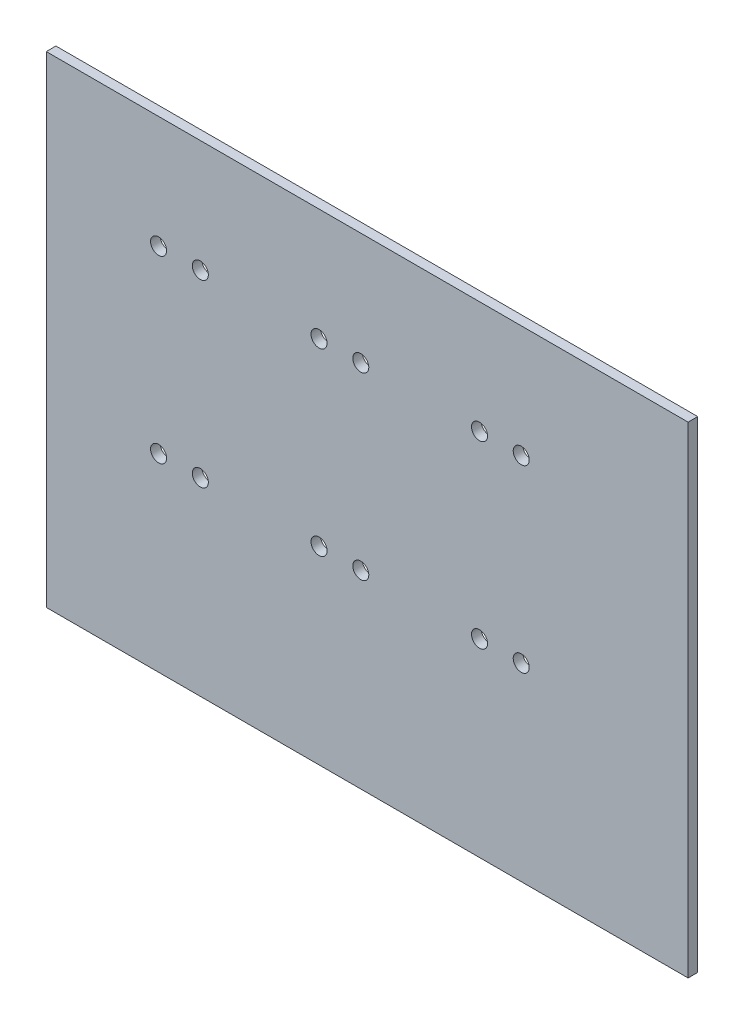
ISO-10303-21;
HEADER;
FILE_DESCRIPTION(('STEP AP214'),'2;1');
FILE_NAME('part.step','',(''),(''),'','','');
FILE_SCHEMA(('AUTOMOTIVE_DESIGN { 1 0 10303 214 1 1 1 1 }'));
ENDSEC;
DATA;
#1=APPLICATION_CONTEXT('core data for automotive mechanical design processes');
#2=APPLICATION_PROTOCOL_DEFINITION('international standard','automotive_design',2000,#1);
#3=PRODUCT_CONTEXT('',#1,'mechanical');
#4=PRODUCT('Part','Part','',(#3));
#5=PRODUCT_RELATED_PRODUCT_CATEGORY('part','',(#4));
#6=PRODUCT_DEFINITION_FORMATION('','',#4);
#7=PRODUCT_DEFINITION_CONTEXT('part definition',#1,'design');
#8=PRODUCT_DEFINITION('design','',#6,#7);
#9=PRODUCT_DEFINITION_SHAPE('','',#8);
#10=(LENGTH_UNIT() NAMED_UNIT(*) SI_UNIT(.MILLI.,.METRE.));
#11=(NAMED_UNIT(*) PLANE_ANGLE_UNIT() SI_UNIT($,.RADIAN.));
#12=(NAMED_UNIT(*) SI_UNIT($,.STERADIAN.) SOLID_ANGLE_UNIT());
#13=UNCERTAINTY_MEASURE_WITH_UNIT(LENGTH_MEASURE(1.E-05),#10,'distance_accuracy_value','');
#14=(GEOMETRIC_REPRESENTATION_CONTEXT(3) GLOBAL_UNCERTAINTY_ASSIGNED_CONTEXT((#13)) GLOBAL_UNIT_ASSIGNED_CONTEXT((#10,
#11,#12)) REPRESENTATION_CONTEXT('',''));
#15=CARTESIAN_POINT('',(0.,0.,0.));
#16=DIRECTION('',(0.,0.,1.));
#17=DIRECTION('',(1.,0.,0.));
#18=AXIS2_PLACEMENT_3D('',#15,#16,#17);
#19=CARTESIAN_POINT('',(100.,75.,3.));
#20=DIRECTION('',(-1.,0.,0.));
#21=DIRECTION('',(0.,-1.,0.));
#22=AXIS2_PLACEMENT_3D('',#19,#20,#21);
#23=PLANE('',#22);
#24=DIRECTION('',(0.,1.,0.));
#25=VECTOR('',#24,1.);
#26=CARTESIAN_POINT('',(100.,75.,0.));
#27=LINE('',#26,#25);
#28=CARTESIAN_POINT('',(100.,-75.,0.));
#29=VERTEX_POINT('',#28);
#30=CARTESIAN_POINT('',(100.,75.,0.));
#31=VERTEX_POINT('',#30);
#32=EDGE_CURVE('E111',#29,#31,#27,.T.);
#33=ORIENTED_EDGE('',*,*,#32,.T.);
#34=DIRECTION('',(0.,0.,-1.));
#35=VECTOR('',#34,1.);
#36=CARTESIAN_POINT('',(100.,75.,3.));
#37=LINE('',#36,#35);
#38=CARTESIAN_POINT('',(100.,75.,3.));
#39=VERTEX_POINT('',#38);
#40=EDGE_CURVE('E11',#39,#31,#37,.T.);
#41=ORIENTED_EDGE('',*,*,#40,.F.);
#42=DIRECTION('',(0.,1.,0.));
#43=VECTOR('',#42,1.);
#44=CARTESIAN_POINT('',(100.,75.,3.));
#45=LINE('',#44,#43);
#46=CARTESIAN_POINT('',(100.,-75.,3.));
#47=VERTEX_POINT('',#46);
#48=EDGE_CURVE('E100',#47,#39,#45,.T.);
#49=ORIENTED_EDGE('',*,*,#48,.F.);
#50=DIRECTION('',(0.,0.,-1.));
#51=VECTOR('',#50,1.);
#52=CARTESIAN_POINT('',(100.,-75.,3.));
#53=LINE('',#52,#51);
#54=EDGE_CURVE('E109',#47,#29,#53,.T.);
#55=ORIENTED_EDGE('',*,*,#54,.T.);
#56=EDGE_LOOP('',(#33,#41,#49,#55));
#57=FACE_BOUND('',#56,.T.);
#58=ADVANCED_FACE('F44',(#57),#23,.F.);
#59=CARTESIAN_POINT('',(-100.,75.,3.));
#60=DIRECTION('',(0.,-1.,0.));
#61=DIRECTION('',(0.,0.,-1.));
#62=AXIS2_PLACEMENT_3D('',#59,#60,#61);
#63=PLANE('',#62);
#64=DIRECTION('',(-1.,0.,0.));
#65=VECTOR('',#64,1.);
#66=CARTESIAN_POINT('',(-100.,75.,0.));
#67=LINE('',#66,#65);
#68=CARTESIAN_POINT('',(-100.,75.,0.));
#69=VERTEX_POINT('',#68);
#70=EDGE_CURVE('E105',#31,#69,#67,.T.);
#71=ORIENTED_EDGE('',*,*,#70,.T.);
#72=DIRECTION('',(0.,0.,-1.));
#73=VECTOR('',#72,1.);
#74=CARTESIAN_POINT('',(-100.,75.,3.));
#75=LINE('',#74,#73);
#76=CARTESIAN_POINT('',(-100.,75.,3.));
#77=VERTEX_POINT('',#76);
#78=EDGE_CURVE('E53',#77,#69,#75,.T.);
#79=ORIENTED_EDGE('',*,*,#78,.F.);
#80=DIRECTION('',(-1.,0.,0.));
#81=VECTOR('',#80,1.);
#82=CARTESIAN_POINT('',(-100.,75.,3.));
#83=LINE('',#82,#81);
#84=EDGE_CURVE('E95',#39,#77,#83,.T.);
#85=ORIENTED_EDGE('',*,*,#84,.F.);
#86=ORIENTED_EDGE('',*,*,#40,.T.);
#87=EDGE_LOOP('',(#71,#79,#85,#86));
#88=FACE_BOUND('',#87,.T.);
#89=ADVANCED_FACE('F102',(#88),#63,.F.);
#90=CARTESIAN_POINT('',(-100.,75.,3.));
#91=DIRECTION('',(1.,0.,0.));
#92=DIRECTION('',(0.,1.,0.));
#93=AXIS2_PLACEMENT_3D('',#90,#91,#92);
#94=PLANE('',#93);
#95=DIRECTION('',(0.,-1.,0.));
#96=VECTOR('',#95,1.);
#97=CARTESIAN_POINT('',(-100.,75.,0.));
#98=LINE('',#97,#96);
#99=CARTESIAN_POINT('',(-100.,-75.,0.));
#100=VERTEX_POINT('',#99);
#101=EDGE_CURVE('E80',#69,#100,#98,.T.);
#102=ORIENTED_EDGE('',*,*,#101,.T.);
#103=DIRECTION('',(0.,0.,-1.));
#104=VECTOR('',#103,1.);
#105=CARTESIAN_POINT('',(-100.,-75.,3.));
#106=LINE('',#105,#104);
#107=CARTESIAN_POINT('',(-100.,-75.,3.));
#108=VERTEX_POINT('',#107);
#109=EDGE_CURVE('E101',#108,#100,#106,.T.);
#110=ORIENTED_EDGE('',*,*,#109,.F.);
#111=DIRECTION('',(0.,-1.,0.));
#112=VECTOR('',#111,1.);
#113=CARTESIAN_POINT('',(-100.,75.,3.));
#114=LINE('',#113,#112);
#115=EDGE_CURVE('E94',#77,#108,#114,.T.);
#116=ORIENTED_EDGE('',*,*,#115,.F.);
#117=ORIENTED_EDGE('',*,*,#78,.T.);
#118=EDGE_LOOP('',(#102,#110,#116,#117));
#119=FACE_BOUND('',#118,.T.);
#120=ADVANCED_FACE('F103',(#119),#94,.F.);
#121=CARTESIAN_POINT('',(-100.,-75.,3.));
#122=DIRECTION('',(0.,1.,0.));
#123=DIRECTION('',(0.,0.,1.));
#124=AXIS2_PLACEMENT_3D('',#121,#122,#123);
#125=PLANE('',#124);
#126=DIRECTION('',(1.,0.,0.));
#127=VECTOR('',#126,1.);
#128=CARTESIAN_POINT('',(-100.,-75.,0.));
#129=LINE('',#128,#127);
#130=EDGE_CURVE('E82',#100,#29,#129,.T.);
#131=ORIENTED_EDGE('',*,*,#130,.T.);
#132=ORIENTED_EDGE('',*,*,#54,.F.);
#133=DIRECTION('',(1.,0.,0.));
#134=VECTOR('',#133,1.);
#135=CARTESIAN_POINT('',(-100.,-75.,3.));
#136=LINE('',#135,#134);
#137=EDGE_CURVE('E65',#108,#47,#136,.T.);
#138=ORIENTED_EDGE('',*,*,#137,.F.);
#139=ORIENTED_EDGE('',*,*,#109,.T.);
#140=EDGE_LOOP('',(#131,#132,#138,#139));
#141=FACE_BOUND('',#140,.T.);
#142=ADVANCED_FACE('F130',(#141),#125,.F.);
#143=CARTESIAN_POINT('',(0.,0.,3.));
#144=DIRECTION('',(0.,0.,1.));
#145=DIRECTION('',(1.,0.,0.));
#146=AXIS2_PLACEMENT_3D('',#143,#144,#145);
#147=PLANE('',#146);
#148=CARTESIAN_POINT('',(-1.99999999999999,-16.,3.));
#149=DIRECTION('',(0.,0.,1.));
#150=DIRECTION('',(1.,0.,0.));
#151=AXIS2_PLACEMENT_3D('',#148,#149,#150);
#152=CIRCLE('',#151,2.5);
#153=CARTESIAN_POINT('',(0.500000000000007,-16.,3.));
#154=VERTEX_POINT('',#153);
#155=EDGE_CURVE('E163',#154,#154,#152,.T.);
#156=ORIENTED_EDGE('',*,*,#155,.F.);
#157=EDGE_LOOP('',(#156));
#158=FACE_BOUND('',#157,.T.);
#159=CARTESIAN_POINT('',(-2.,40.,3.));
#160=DIRECTION('',(0.,0.,1.));
#161=DIRECTION('',(1.,0.,0.));
#162=AXIS2_PLACEMENT_3D('',#159,#160,#161);
#163=CIRCLE('',#162,2.5);
#164=CARTESIAN_POINT('',(0.500000000000001,40.,3.));
#165=VERTEX_POINT('',#164);
#166=EDGE_CURVE('E178',#165,#165,#163,.T.);
#167=ORIENTED_EDGE('',*,*,#166,.F.);
#168=EDGE_LOOP('',(#167));
#169=FACE_BOUND('',#168,.T.);
#170=CARTESIAN_POINT('',(-15.,40.,3.));
#171=DIRECTION('',(0.,0.,1.));
#172=DIRECTION('',(1.,0.,0.));
#173=AXIS2_PLACEMENT_3D('',#170,#171,#172);
#174=CIRCLE('',#173,2.5);
#175=CARTESIAN_POINT('',(-12.5,40.,3.));
#176=VERTEX_POINT('',#175);
#177=EDGE_CURVE('E177',#176,#176,#174,.T.);
#178=ORIENTED_EDGE('',*,*,#177,.F.);
#179=EDGE_LOOP('',(#178));
#180=FACE_BOUND('',#179,.T.);
#181=CARTESIAN_POINT('',(35.,40.,3.));
#182=DIRECTION('',(0.,0.,1.));
#183=DIRECTION('',(1.,0.,0.));
#184=AXIS2_PLACEMENT_3D('',#181,#182,#183);
#185=CIRCLE('',#184,2.5);
#186=CARTESIAN_POINT('',(37.5,40.,3.));
#187=VERTEX_POINT('',#186);
#188=EDGE_CURVE('E191',#187,#187,#185,.T.);
#189=ORIENTED_EDGE('',*,*,#188,.F.);
#190=EDGE_LOOP('',(#189));
#191=FACE_BOUND('',#190,.T.);
#192=CARTESIAN_POINT('',(-52.,40.,3.));
#193=DIRECTION('',(0.,0.,1.));
#194=DIRECTION('',(1.,0.,0.));
#195=AXIS2_PLACEMENT_3D('',#192,#193,#194);
#196=CIRCLE('',#195,2.5);
#197=CARTESIAN_POINT('',(-49.5,40.,3.));
#198=VERTEX_POINT('',#197);
#199=EDGE_CURVE('E138',#198,#198,#196,.T.);
#200=ORIENTED_EDGE('',*,*,#199,.F.);
#201=EDGE_LOOP('',(#200));
#202=FACE_BOUND('',#201,.T.);
#203=CARTESIAN_POINT('',(-52.,-16.,3.));
#204=DIRECTION('',(0.,0.,1.));
#205=DIRECTION('',(1.,0.,0.));
#206=AXIS2_PLACEMENT_3D('',#203,#204,#205);
#207=CIRCLE('',#206,2.5);
#208=CARTESIAN_POINT('',(-49.5,-16.,3.));
#209=VERTEX_POINT('',#208);
#210=EDGE_CURVE('E147',#209,#209,#207,.T.);
#211=ORIENTED_EDGE('',*,*,#210,.F.);
#212=EDGE_LOOP('',(#211));
#213=FACE_BOUND('',#212,.T.);
#214=CARTESIAN_POINT('',(-65.,-16.,3.));
#215=DIRECTION('',(0.,0.,1.));
#216=DIRECTION('',(1.,0.,0.));
#217=AXIS2_PLACEMENT_3D('',#214,#215,#216);
#218=CIRCLE('',#217,2.50000000000001);
#219=CARTESIAN_POINT('',(-62.5,-16.,3.));
#220=VERTEX_POINT('',#219);
#221=EDGE_CURVE('E150',#220,#220,#218,.T.);
#222=ORIENTED_EDGE('',*,*,#221,.F.);
#223=EDGE_LOOP('',(#222));
#224=FACE_BOUND('',#223,.T.);
#225=CARTESIAN_POINT('',(-15.,-16.,3.));
#226=DIRECTION('',(0.,0.,1.));
#227=DIRECTION('',(1.,0.,0.));
#228=AXIS2_PLACEMENT_3D('',#225,#226,#227);
#229=CIRCLE('',#228,2.5);
#230=CARTESIAN_POINT('',(-12.5,-16.,3.));
#231=VERTEX_POINT('',#230);
#232=EDGE_CURVE('E165',#231,#231,#229,.T.);
#233=ORIENTED_EDGE('',*,*,#232,.F.);
#234=EDGE_LOOP('',(#233));
#235=FACE_BOUND('',#234,.T.);
#236=CARTESIAN_POINT('',(48.,40.,3.));
#237=DIRECTION('',(0.,0.,1.));
#238=DIRECTION('',(1.,0.,0.));
#239=AXIS2_PLACEMENT_3D('',#236,#237,#238);
#240=CIRCLE('',#239,2.5);
#241=CARTESIAN_POINT('',(50.5,40.,3.));
#242=VERTEX_POINT('',#241);
#243=EDGE_CURVE('E193',#242,#242,#240,.T.);
#244=ORIENTED_EDGE('',*,*,#243,.F.);
#245=EDGE_LOOP('',(#244));
#246=FACE_BOUND('',#245,.T.);
#247=CARTESIAN_POINT('',(48.,-16.,3.));
#248=DIRECTION('',(0.,0.,1.));
#249=DIRECTION('',(1.,0.,0.));
#250=AXIS2_PLACEMENT_3D('',#247,#248,#249);
#251=CIRCLE('',#250,2.5);
#252=CARTESIAN_POINT('',(50.5,-16.,3.));
#253=VERTEX_POINT('',#252);
#254=EDGE_CURVE('E216',#253,#253,#251,.T.);
#255=ORIENTED_EDGE('',*,*,#254,.F.);
#256=EDGE_LOOP('',(#255));
#257=FACE_BOUND('',#256,.T.);
#258=CARTESIAN_POINT('',(35.,-16.,3.));
#259=DIRECTION('',(0.,0.,1.));
#260=DIRECTION('',(1.,0.,0.));
#261=AXIS2_PLACEMENT_3D('',#258,#259,#260);
#262=CIRCLE('',#261,2.5);
#263=CARTESIAN_POINT('',(37.5,-16.,3.));
#264=VERTEX_POINT('',#263);
#265=EDGE_CURVE('E206',#264,#264,#262,.T.);
#266=ORIENTED_EDGE('',*,*,#265,.F.);
#267=EDGE_LOOP('',(#266));
#268=FACE_BOUND('',#267,.T.);
#269=CARTESIAN_POINT('',(-65.,40.,3.));
#270=DIRECTION('',(0.,0.,1.));
#271=DIRECTION('',(1.,0.,0.));
#272=AXIS2_PLACEMENT_3D('',#269,#270,#271);
#273=CIRCLE('',#272,2.5);
#274=CARTESIAN_POINT('',(-62.5,40.,3.));
#275=VERTEX_POINT('',#274);
#276=EDGE_CURVE('E132',#275,#275,#273,.T.);
#277=ORIENTED_EDGE('',*,*,#276,.F.);
#278=EDGE_LOOP('',(#277));
#279=FACE_BOUND('',#278,.T.);
#280=ORIENTED_EDGE('',*,*,#48,.T.);
#281=ORIENTED_EDGE('',*,*,#84,.T.);
#282=ORIENTED_EDGE('',*,*,#115,.T.);
#283=ORIENTED_EDGE('',*,*,#137,.T.);
#284=EDGE_LOOP('',(#280,#281,#282,#283));
#285=FACE_BOUND('',#284,.T.);
#286=ADVANCED_FACE('F93',(#158,#169,#180,#191,#202,#213,#224,#235,#246,#257,#268,#279,#285),
#147,.T.);
#287=CARTESIAN_POINT('',(0.,0.,0.));
#288=DIRECTION('',(0.,0.,1.));
#289=DIRECTION('',(1.,0.,0.));
#290=AXIS2_PLACEMENT_3D('',#287,#288,#289);
#291=PLANE('',#290);
#292=CARTESIAN_POINT('',(-1.99999999999999,-16.,0.));
#293=DIRECTION('',(0.,0.,1.));
#294=DIRECTION('',(1.,0.,0.));
#295=AXIS2_PLACEMENT_3D('',#292,#293,#294);
#296=CIRCLE('',#295,2.5);
#297=CARTESIAN_POINT('',(0.500000000000007,-16.,0.));
#298=VERTEX_POINT('',#297);
#299=EDGE_CURVE('E183',#298,#298,#296,.T.);
#300=ORIENTED_EDGE('',*,*,#299,.T.);
#301=EDGE_LOOP('',(#300));
#302=FACE_BOUND('',#301,.T.);
#303=CARTESIAN_POINT('',(-2.,40.,0.));
#304=DIRECTION('',(0.,0.,1.));
#305=DIRECTION('',(1.,0.,0.));
#306=AXIS2_PLACEMENT_3D('',#303,#304,#305);
#307=CIRCLE('',#306,2.5);
#308=CARTESIAN_POINT('',(0.500000000000001,40.,0.));
#309=VERTEX_POINT('',#308);
#310=EDGE_CURVE('E174',#309,#309,#307,.T.);
#311=ORIENTED_EDGE('',*,*,#310,.T.);
#312=EDGE_LOOP('',(#311));
#313=FACE_BOUND('',#312,.T.);
#314=CARTESIAN_POINT('',(-15.,40.,0.));
#315=DIRECTION('',(0.,0.,1.));
#316=DIRECTION('',(1.,0.,0.));
#317=AXIS2_PLACEMENT_3D('',#314,#315,#316);
#318=CIRCLE('',#317,2.5);
#319=CARTESIAN_POINT('',(-12.5,40.,0.));
#320=VERTEX_POINT('',#319);
#321=EDGE_CURVE('E199',#320,#320,#318,.T.);
#322=ORIENTED_EDGE('',*,*,#321,.T.);
#323=EDGE_LOOP('',(#322));
#324=FACE_BOUND('',#323,.T.);
#325=CARTESIAN_POINT('',(35.,40.,0.));
#326=DIRECTION('',(0.,0.,1.));
#327=DIRECTION('',(1.,0.,0.));
#328=AXIS2_PLACEMENT_3D('',#325,#326,#327);
#329=CIRCLE('',#328,2.5);
#330=CARTESIAN_POINT('',(37.5,40.,0.));
#331=VERTEX_POINT('',#330);
#332=EDGE_CURVE('E189',#331,#331,#329,.T.);
#333=ORIENTED_EDGE('',*,*,#332,.T.);
#334=EDGE_LOOP('',(#333));
#335=FACE_BOUND('',#334,.T.);
#336=CARTESIAN_POINT('',(-52.,40.,0.));
#337=DIRECTION('',(0.,0.,1.));
#338=DIRECTION('',(1.,0.,0.));
#339=AXIS2_PLACEMENT_3D('',#336,#337,#338);
#340=CIRCLE('',#339,2.5);
#341=CARTESIAN_POINT('',(-49.5,40.,0.));
#342=VERTEX_POINT('',#341);
#343=EDGE_CURVE('E152',#342,#342,#340,.T.);
#344=ORIENTED_EDGE('',*,*,#343,.T.);
#345=EDGE_LOOP('',(#344));
#346=FACE_BOUND('',#345,.T.);
#347=CARTESIAN_POINT('',(-52.,-16.,0.));
#348=DIRECTION('',(0.,0.,1.));
#349=DIRECTION('',(1.,0.,0.));
#350=AXIS2_PLACEMENT_3D('',#347,#348,#349);
#351=CIRCLE('',#350,2.5);
#352=CARTESIAN_POINT('',(-49.5,-16.,0.));
#353=VERTEX_POINT('',#352);
#354=EDGE_CURVE('E145',#353,#353,#351,.T.);
#355=ORIENTED_EDGE('',*,*,#354,.T.);
#356=EDGE_LOOP('',(#355));
#357=FACE_BOUND('',#356,.T.);
#358=CARTESIAN_POINT('',(-65.,-16.,0.));
#359=DIRECTION('',(0.,0.,1.));
#360=DIRECTION('',(1.,0.,0.));
#361=AXIS2_PLACEMENT_3D('',#358,#359,#360);
#362=CIRCLE('',#361,2.50000000000001);
#363=CARTESIAN_POINT('',(-62.5,-16.,0.));
#364=VERTEX_POINT('',#363);
#365=EDGE_CURVE('E167',#364,#364,#362,.T.);
#366=ORIENTED_EDGE('',*,*,#365,.T.);
#367=EDGE_LOOP('',(#366));
#368=FACE_BOUND('',#367,.T.);
#369=CARTESIAN_POINT('',(-15.,-16.,0.));
#370=DIRECTION('',(0.,0.,1.));
#371=DIRECTION('',(1.,0.,0.));
#372=AXIS2_PLACEMENT_3D('',#369,#370,#371);
#373=CIRCLE('',#372,2.5);
#374=CARTESIAN_POINT('',(-12.5,-16.,0.));
#375=VERTEX_POINT('',#374);
#376=EDGE_CURVE('E156',#375,#375,#373,.T.);
#377=ORIENTED_EDGE('',*,*,#376,.T.);
#378=EDGE_LOOP('',(#377));
#379=FACE_BOUND('',#378,.T.);
#380=CARTESIAN_POINT('',(48.,40.,0.));
#381=DIRECTION('',(0.,0.,1.));
#382=DIRECTION('',(1.,0.,0.));
#383=AXIS2_PLACEMENT_3D('',#380,#381,#382);
#384=CIRCLE('',#383,2.5);
#385=CARTESIAN_POINT('',(50.5,40.,0.));
#386=VERTEX_POINT('',#385);
#387=EDGE_CURVE('E225',#386,#386,#384,.T.);
#388=ORIENTED_EDGE('',*,*,#387,.T.);
#389=EDGE_LOOP('',(#388));
#390=FACE_BOUND('',#389,.T.);
#391=CARTESIAN_POINT('',(48.,-16.,0.));
#392=DIRECTION('',(0.,0.,1.));
#393=DIRECTION('',(1.,0.,0.));
#394=AXIS2_PLACEMENT_3D('',#391,#392,#393);
#395=CIRCLE('',#394,2.5);
#396=CARTESIAN_POINT('',(50.5,-16.,0.));
#397=VERTEX_POINT('',#396);
#398=EDGE_CURVE('E215',#397,#397,#395,.T.);
#399=ORIENTED_EDGE('',*,*,#398,.T.);
#400=EDGE_LOOP('',(#399));
#401=FACE_BOUND('',#400,.T.);
#402=CARTESIAN_POINT('',(35.,-16.,0.));
#403=DIRECTION('',(0.,0.,1.));
#404=DIRECTION('',(1.,0.,0.));
#405=AXIS2_PLACEMENT_3D('',#402,#403,#404);
#406=CIRCLE('',#405,2.5);
#407=CARTESIAN_POINT('',(37.5,-16.,0.));
#408=VERTEX_POINT('',#407);
#409=EDGE_CURVE('E207',#408,#408,#406,.T.);
#410=ORIENTED_EDGE('',*,*,#409,.T.);
#411=EDGE_LOOP('',(#410));
#412=FACE_BOUND('',#411,.T.);
#413=CARTESIAN_POINT('',(-65.,40.,0.));
#414=DIRECTION('',(0.,0.,1.));
#415=DIRECTION('',(1.,0.,0.));
#416=AXIS2_PLACEMENT_3D('',#413,#414,#415);
#417=CIRCLE('',#416,2.5);
#418=CARTESIAN_POINT('',(-62.5,40.,0.));
#419=VERTEX_POINT('',#418);
#420=EDGE_CURVE('E120',#419,#419,#417,.T.);
#421=ORIENTED_EDGE('',*,*,#420,.T.);
#422=EDGE_LOOP('',(#421));
#423=FACE_BOUND('',#422,.T.);
#424=ORIENTED_EDGE('',*,*,#32,.F.);
#425=ORIENTED_EDGE('',*,*,#130,.F.);
#426=ORIENTED_EDGE('',*,*,#101,.F.);
#427=ORIENTED_EDGE('',*,*,#70,.F.);
#428=EDGE_LOOP('',(#424,#425,#426,#427));
#429=FACE_BOUND('',#428,.T.);
#430=ADVANCED_FACE('F127',(#302,#313,#324,#335,#346,#357,#368,#379,#390,#401,#412,#423,#429),
#291,.F.);
#431=CARTESIAN_POINT('',(-65.,40.,0.));
#432=DIRECTION('',(0.,0.,1.));
#433=DIRECTION('',(1.,0.,0.));
#434=AXIS2_PLACEMENT_3D('',#431,#432,#433);
#435=CYLINDRICAL_SURFACE('',#434,2.5);
#436=ORIENTED_EDGE('',*,*,#420,.F.);
#437=EDGE_LOOP('',(#436));
#438=FACE_BOUND('',#437,.T.);
#439=ORIENTED_EDGE('',*,*,#276,.T.);
#440=EDGE_LOOP('',(#439));
#441=FACE_BOUND('',#440,.T.);
#442=ADVANCED_FACE('F245',(#438,#441),#435,.F.);
#443=CARTESIAN_POINT('',(35.,-16.,0.));
#444=DIRECTION('',(0.,0.,1.));
#445=DIRECTION('',(1.,0.,0.));
#446=AXIS2_PLACEMENT_3D('',#443,#444,#445);
#447=CYLINDRICAL_SURFACE('',#446,2.5);
#448=ORIENTED_EDGE('',*,*,#409,.F.);
#449=EDGE_LOOP('',(#448));
#450=FACE_BOUND('',#449,.T.);
#451=ORIENTED_EDGE('',*,*,#265,.T.);
#452=EDGE_LOOP('',(#451));
#453=FACE_BOUND('',#452,.T.);
#454=ADVANCED_FACE('F244',(#450,#453),#447,.F.);
#455=CARTESIAN_POINT('',(48.,-16.,0.));
#456=DIRECTION('',(0.,0.,1.));
#457=DIRECTION('',(1.,0.,0.));
#458=AXIS2_PLACEMENT_3D('',#455,#456,#457);
#459=CYLINDRICAL_SURFACE('',#458,2.5);
#460=ORIENTED_EDGE('',*,*,#398,.F.);
#461=EDGE_LOOP('',(#460));
#462=FACE_BOUND('',#461,.T.);
#463=ORIENTED_EDGE('',*,*,#254,.T.);
#464=EDGE_LOOP('',(#463));
#465=FACE_BOUND('',#464,.T.);
#466=ADVANCED_FACE('F252',(#462,#465),#459,.F.);
#467=CARTESIAN_POINT('',(48.,40.,0.));
#468=DIRECTION('',(0.,0.,1.));
#469=DIRECTION('',(1.,0.,0.));
#470=AXIS2_PLACEMENT_3D('',#467,#468,#469);
#471=CYLINDRICAL_SURFACE('',#470,2.5);
#472=ORIENTED_EDGE('',*,*,#387,.F.);
#473=EDGE_LOOP('',(#472));
#474=FACE_BOUND('',#473,.T.);
#475=ORIENTED_EDGE('',*,*,#243,.T.);
#476=EDGE_LOOP('',(#475));
#477=FACE_BOUND('',#476,.T.);
#478=ADVANCED_FACE('F229',(#474,#477),#471,.F.);
#479=CARTESIAN_POINT('',(-15.,-16.,0.));
#480=DIRECTION('',(0.,0.,1.));
#481=DIRECTION('',(1.,0.,0.));
#482=AXIS2_PLACEMENT_3D('',#479,#480,#481);
#483=CYLINDRICAL_SURFACE('',#482,2.5);
#484=ORIENTED_EDGE('',*,*,#376,.F.);
#485=EDGE_LOOP('',(#484));
#486=FACE_BOUND('',#485,.T.);
#487=ORIENTED_EDGE('',*,*,#232,.T.);
#488=EDGE_LOOP('',(#487));
#489=FACE_BOUND('',#488,.T.);
#490=ADVANCED_FACE('F311',(#486,#489),#483,.F.);
#491=CARTESIAN_POINT('',(-65.,-16.,0.));
#492=DIRECTION('',(0.,0.,1.));
#493=DIRECTION('',(1.,0.,0.));
#494=AXIS2_PLACEMENT_3D('',#491,#492,#493);
#495=CYLINDRICAL_SURFACE('',#494,2.50000000000001);
#496=ORIENTED_EDGE('',*,*,#365,.F.);
#497=EDGE_LOOP('',(#496));
#498=FACE_BOUND('',#497,.T.);
#499=ORIENTED_EDGE('',*,*,#221,.T.);
#500=EDGE_LOOP('',(#499));
#501=FACE_BOUND('',#500,.T.);
#502=ADVANCED_FACE('F321',(#498,#501),#495,.F.);
#503=CARTESIAN_POINT('',(-52.,-16.,0.));
#504=DIRECTION('',(0.,0.,1.));
#505=DIRECTION('',(1.,0.,0.));
#506=AXIS2_PLACEMENT_3D('',#503,#504,#505);
#507=CYLINDRICAL_SURFACE('',#506,2.5);
#508=ORIENTED_EDGE('',*,*,#354,.F.);
#509=EDGE_LOOP('',(#508));
#510=FACE_BOUND('',#509,.T.);
#511=ORIENTED_EDGE('',*,*,#210,.T.);
#512=EDGE_LOOP('',(#511));
#513=FACE_BOUND('',#512,.T.);
#514=ADVANCED_FACE('F332',(#510,#513),#507,.F.);
#515=CARTESIAN_POINT('',(-52.,40.,0.));
#516=DIRECTION('',(0.,0.,1.));
#517=DIRECTION('',(1.,0.,0.));
#518=AXIS2_PLACEMENT_3D('',#515,#516,#517);
#519=CYLINDRICAL_SURFACE('',#518,2.5);
#520=ORIENTED_EDGE('',*,*,#343,.F.);
#521=EDGE_LOOP('',(#520));
#522=FACE_BOUND('',#521,.T.);
#523=ORIENTED_EDGE('',*,*,#199,.T.);
#524=EDGE_LOOP('',(#523));
#525=FACE_BOUND('',#524,.T.);
#526=ADVANCED_FACE('F342',(#522,#525),#519,.F.);
#527=CARTESIAN_POINT('',(35.,40.,0.));
#528=DIRECTION('',(0.,0.,1.));
#529=DIRECTION('',(1.,0.,0.));
#530=AXIS2_PLACEMENT_3D('',#527,#528,#529);
#531=CYLINDRICAL_SURFACE('',#530,2.5);
#532=ORIENTED_EDGE('',*,*,#332,.F.);
#533=EDGE_LOOP('',(#532));
#534=FACE_BOUND('',#533,.T.);
#535=ORIENTED_EDGE('',*,*,#188,.T.);
#536=EDGE_LOOP('',(#535));
#537=FACE_BOUND('',#536,.T.);
#538=ADVANCED_FACE('F349',(#534,#537),#531,.F.);
#539=CARTESIAN_POINT('',(-15.,40.,0.));
#540=DIRECTION('',(0.,0.,1.));
#541=DIRECTION('',(1.,0.,0.));
#542=AXIS2_PLACEMENT_3D('',#539,#540,#541);
#543=CYLINDRICAL_SURFACE('',#542,2.5);
#544=ORIENTED_EDGE('',*,*,#321,.F.);
#545=EDGE_LOOP('',(#544));
#546=FACE_BOUND('',#545,.T.);
#547=ORIENTED_EDGE('',*,*,#177,.T.);
#548=EDGE_LOOP('',(#547));
#549=FACE_BOUND('',#548,.T.);
#550=ADVANCED_FACE('F359',(#546,#549),#543,.F.);
#551=CARTESIAN_POINT('',(-2.,40.,0.));
#552=DIRECTION('',(0.,0.,1.));
#553=DIRECTION('',(1.,0.,0.));
#554=AXIS2_PLACEMENT_3D('',#551,#552,#553);
#555=CYLINDRICAL_SURFACE('',#554,2.5);
#556=ORIENTED_EDGE('',*,*,#310,.F.);
#557=EDGE_LOOP('',(#556));
#558=FACE_BOUND('',#557,.T.);
#559=ORIENTED_EDGE('',*,*,#166,.T.);
#560=EDGE_LOOP('',(#559));
#561=FACE_BOUND('',#560,.T.);
#562=ADVANCED_FACE('F369',(#558,#561),#555,.F.);
#563=CARTESIAN_POINT('',(-1.99999999999999,-16.,0.));
#564=DIRECTION('',(0.,0.,1.));
#565=DIRECTION('',(1.,0.,0.));
#566=AXIS2_PLACEMENT_3D('',#563,#564,#565);
#567=CYLINDRICAL_SURFACE('',#566,2.5);
#568=ORIENTED_EDGE('',*,*,#299,.F.);
#569=EDGE_LOOP('',(#568));
#570=FACE_BOUND('',#569,.T.);
#571=ORIENTED_EDGE('',*,*,#155,.T.);
#572=EDGE_LOOP('',(#571));
#573=FACE_BOUND('',#572,.T.);
#574=ADVANCED_FACE('F376',(#570,#573),#567,.F.);
#575=CLOSED_SHELL('',(#58,#89,#120,#142,#286,#430,#442,#454,#466,#478,#490,#502,#514,#526,#538,
#550,#562,#574));
#576=MANIFOLD_SOLID_BREP('B2',#575);
#577=ADVANCED_BREP_SHAPE_REPRESENTATION('',(#18,#576),#14);
#578=SHAPE_DEFINITION_REPRESENTATION(#9,#577);
ENDSEC;
END-ISO-10303-21;
